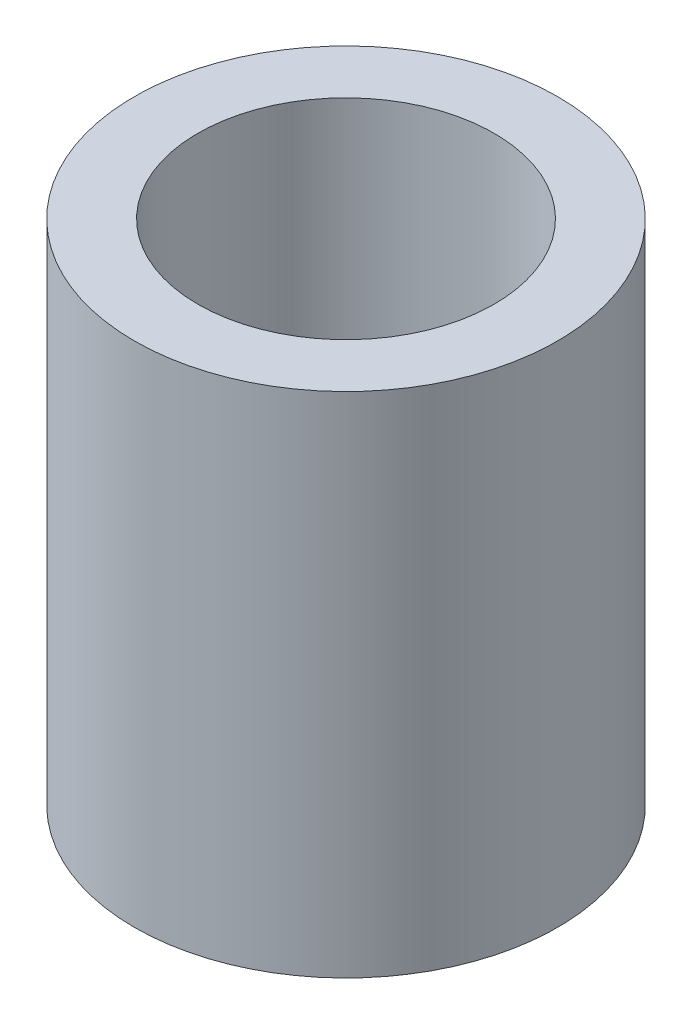
ISO-10303-21;
HEADER;
FILE_DESCRIPTION(('STEP AP214'),'2;1');
FILE_NAME('part.step','',(''),(''),'','','');
FILE_SCHEMA(('AUTOMOTIVE_DESIGN { 1 0 10303 214 1 1 1 1 }'));
ENDSEC;
DATA;
#1=APPLICATION_CONTEXT('core data for automotive mechanical design processes');
#2=APPLICATION_PROTOCOL_DEFINITION('international standard','automotive_design',2000,#1);
#3=PRODUCT_CONTEXT('',#1,'mechanical');
#4=PRODUCT('Part','Part','',(#3));
#5=PRODUCT_RELATED_PRODUCT_CATEGORY('part','',(#4));
#6=PRODUCT_DEFINITION_FORMATION('','',#4);
#7=PRODUCT_DEFINITION_CONTEXT('part definition',#1,'design');
#8=PRODUCT_DEFINITION('design','',#6,#7);
#9=PRODUCT_DEFINITION_SHAPE('','',#8);
#10=(LENGTH_UNIT() NAMED_UNIT(*) SI_UNIT(.MILLI.,.METRE.));
#11=(NAMED_UNIT(*) PLANE_ANGLE_UNIT() SI_UNIT($,.RADIAN.));
#12=(NAMED_UNIT(*) SI_UNIT($,.STERADIAN.) SOLID_ANGLE_UNIT());
#13=UNCERTAINTY_MEASURE_WITH_UNIT(LENGTH_MEASURE(1.E-05),#10,'distance_accuracy_value','');
#14=(GEOMETRIC_REPRESENTATION_CONTEXT(3) GLOBAL_UNCERTAINTY_ASSIGNED_CONTEXT((#13)) GLOBAL_UNIT_ASSIGNED_CONTEXT((#10,
#11,#12)) REPRESENTATION_CONTEXT('',''));
#15=CARTESIAN_POINT('',(0.,0.,0.));
#16=DIRECTION('',(0.,0.,1.));
#17=DIRECTION('',(1.,0.,0.));
#18=AXIS2_PLACEMENT_3D('',#15,#16,#17);
#19=CARTESIAN_POINT('',(0.,-6.858,0.));
#20=DIRECTION('',(0.,1.,0.));
#21=DIRECTION('',(0.,0.,1.));
#22=AXIS2_PLACEMENT_3D('',#19,#20,#21);
#23=CYLINDRICAL_SURFACE('',#22,2.8575);
#24=CARTESIAN_POINT('',(0.,-6.858,0.));
#25=DIRECTION('',(0.,1.,0.));
#26=DIRECTION('',(0.,0.,1.));
#27=AXIS2_PLACEMENT_3D('',#24,#25,#26);
#28=CIRCLE('',#27,2.8575);
#29=CARTESIAN_POINT('',(0.,-6.858,2.8575));
#30=VERTEX_POINT('',#29);
#31=EDGE_CURVE('E10',#30,#30,#28,.T.);
#32=ORIENTED_EDGE('',*,*,#31,.T.);
#33=EDGE_LOOP('',(#32));
#34=FACE_BOUND('',#33,.T.);
#35=CARTESIAN_POINT('',(0.,0.,0.));
#36=DIRECTION('',(0.,1.,0.));
#37=DIRECTION('',(0.,0.,1.));
#38=AXIS2_PLACEMENT_3D('',#35,#36,#37);
#39=CIRCLE('',#38,2.8575);
#40=CARTESIAN_POINT('',(0.,0.,2.8575));
#41=VERTEX_POINT('',#40);
#42=EDGE_CURVE('E40',#41,#41,#39,.T.);
#43=ORIENTED_EDGE('',*,*,#42,.F.);
#44=EDGE_LOOP('',(#43));
#45=FACE_BOUND('',#44,.T.);
#46=ADVANCED_FACE('F37',(#34,#45),#23,.T.);
#47=CARTESIAN_POINT('',(0.,-6.858,0.));
#48=DIRECTION('',(0.,1.,0.));
#49=DIRECTION('',(0.,0.,1.));
#50=AXIS2_PLACEMENT_3D('',#47,#48,#49);
#51=PLANE('',#50);
#52=CARTESIAN_POINT('',(0.,-6.858,0.));
#53=DIRECTION('',(0.,1.,0.));
#54=DIRECTION('',(0.,0.,1.));
#55=AXIS2_PLACEMENT_3D('',#52,#53,#54);
#56=CIRCLE('',#55,2.);
#57=CARTESIAN_POINT('',(0.,-6.858,2.));
#58=VERTEX_POINT('',#57);
#59=EDGE_CURVE('E49',#58,#58,#56,.T.);
#60=ORIENTED_EDGE('',*,*,#59,.T.);
#61=EDGE_LOOP('',(#60));
#62=FACE_BOUND('',#61,.T.);
#63=ORIENTED_EDGE('',*,*,#31,.F.);
#64=EDGE_LOOP('',(#63));
#65=FACE_BOUND('',#64,.T.);
#66=ADVANCED_FACE('F59',(#62,#65),#51,.F.);
#67=CARTESIAN_POINT('',(0.,0.,0.));
#68=DIRECTION('',(0.,1.,0.));
#69=DIRECTION('',(0.,0.,1.));
#70=AXIS2_PLACEMENT_3D('',#67,#68,#69);
#71=PLANE('',#70);
#72=CARTESIAN_POINT('',(0.,0.,0.));
#73=DIRECTION('',(0.,1.,0.));
#74=DIRECTION('',(0.,0.,1.));
#75=AXIS2_PLACEMENT_3D('',#72,#73,#74);
#76=CIRCLE('',#75,2.);
#77=CARTESIAN_POINT('',(0.,0.,2.));
#78=VERTEX_POINT('',#77);
#79=EDGE_CURVE('E51',#78,#78,#76,.T.);
#80=ORIENTED_EDGE('',*,*,#79,.F.);
#81=EDGE_LOOP('',(#80));
#82=FACE_BOUND('',#81,.T.);
#83=ORIENTED_EDGE('',*,*,#42,.T.);
#84=EDGE_LOOP('',(#83));
#85=FACE_BOUND('',#84,.T.);
#86=ADVANCED_FACE('F65',(#82,#85),#71,.T.);
#87=CARTESIAN_POINT('',(0.,-6.858,0.));
#88=DIRECTION('',(0.,1.,0.));
#89=DIRECTION('',(0.,0.,1.));
#90=AXIS2_PLACEMENT_3D('',#87,#88,#89);
#91=CYLINDRICAL_SURFACE('',#90,2.);
#92=ORIENTED_EDGE('',*,*,#59,.F.);
#93=EDGE_LOOP('',(#92));
#94=FACE_BOUND('',#93,.T.);
#95=ORIENTED_EDGE('',*,*,#79,.T.);
#96=EDGE_LOOP('',(#95));
#97=FACE_BOUND('',#96,.T.);
#98=ADVANCED_FACE('F62',(#94,#97),#91,.F.);
#99=CLOSED_SHELL('',(#46,#66,#86,#98));
#100=MANIFOLD_SOLID_BREP('B2',#99);
#101=ADVANCED_BREP_SHAPE_REPRESENTATION('',(#18,#100),#14);
#102=SHAPE_DEFINITION_REPRESENTATION(#9,#101);
ENDSEC;
END-ISO-10303-21;
